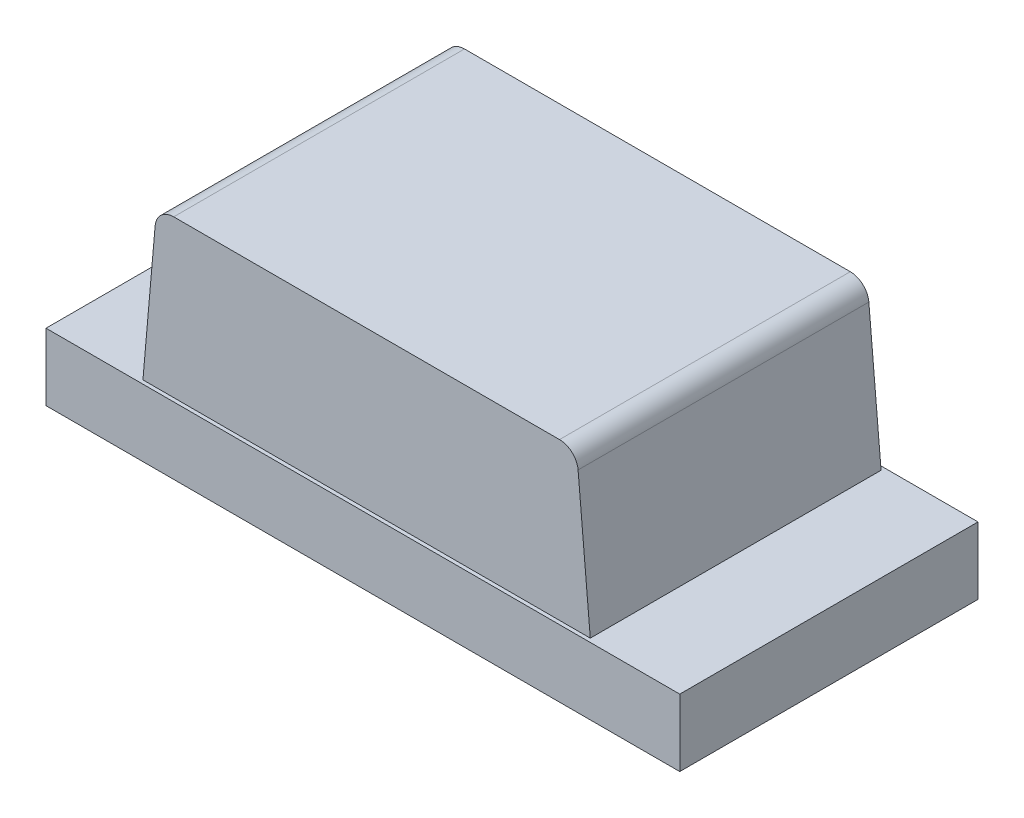
ISO-10303-21;
HEADER;
FILE_DESCRIPTION(('STEP AP214'),'2;1');
FILE_NAME('part.step','',(''),(''),'','','');
FILE_SCHEMA(('AUTOMOTIVE_DESIGN { 1 0 10303 214 1 1 1 1 }'));
ENDSEC;
DATA;
#1=APPLICATION_CONTEXT('core data for automotive mechanical design processes');
#2=APPLICATION_PROTOCOL_DEFINITION('international standard','automotive_design',2000,#1);
#3=PRODUCT_CONTEXT('',#1,'mechanical');
#4=PRODUCT('Part','Part','',(#3));
#5=PRODUCT_RELATED_PRODUCT_CATEGORY('part','',(#4));
#6=PRODUCT_DEFINITION_FORMATION('','',#4);
#7=PRODUCT_DEFINITION_CONTEXT('part definition',#1,'design');
#8=PRODUCT_DEFINITION('design','',#6,#7);
#9=PRODUCT_DEFINITION_SHAPE('','',#8);
#10=(LENGTH_UNIT() NAMED_UNIT(*) SI_UNIT(.MILLI.,.METRE.));
#11=(NAMED_UNIT(*) PLANE_ANGLE_UNIT() SI_UNIT($,.RADIAN.));
#12=(NAMED_UNIT(*) SI_UNIT($,.STERADIAN.) SOLID_ANGLE_UNIT());
#13=UNCERTAINTY_MEASURE_WITH_UNIT(LENGTH_MEASURE(1.E-05),#10,'distance_accuracy_value','');
#14=(GEOMETRIC_REPRESENTATION_CONTEXT(3) GLOBAL_UNCERTAINTY_ASSIGNED_CONTEXT((#13)) GLOBAL_UNIT_ASSIGNED_CONTEXT((#10,
#11,#12)) REPRESENTATION_CONTEXT('',''));
#15=CARTESIAN_POINT('',(0.,0.,0.));
#16=DIRECTION('',(0.,0.,1.));
#17=DIRECTION('',(1.,0.,0.));
#18=AXIS2_PLACEMENT_3D('',#15,#16,#17);
#19=CARTESIAN_POINT('',(0.,0.18,0.));
#20=DIRECTION('',(0.,1.,0.));
#21=DIRECTION('',(0.,0.,1.));
#22=AXIS2_PLACEMENT_3D('',#19,#20,#21);
#23=PLANE('',#22);
#24=DIRECTION('',(0.,0.,1.));
#25=VECTOR('',#24,1.);
#26=CARTESIAN_POINT('',(-0.85,0.18,0.4));
#27=LINE('',#26,#25);
#28=CARTESIAN_POINT('',(-0.85,0.18,-0.4));
#29=VERTEX_POINT('',#28);
#30=CARTESIAN_POINT('',(-0.85,0.18,0.4));
#31=VERTEX_POINT('',#30);
#32=EDGE_CURVE('E144',#29,#31,#27,.T.);
#33=ORIENTED_EDGE('',*,*,#32,.T.);
#34=DIRECTION('',(1.,0.,0.));
#35=VECTOR('',#34,1.);
#36=CARTESIAN_POINT('',(0.85,0.18,0.4));
#37=LINE('',#36,#35);
#38=CARTESIAN_POINT('',(0.85,0.18,0.4));
#39=VERTEX_POINT('',#38);
#40=EDGE_CURVE('E147',#31,#39,#37,.T.);
#41=ORIENTED_EDGE('',*,*,#40,.T.);
#42=DIRECTION('',(0.,0.,-1.));
#43=VECTOR('',#42,1.);
#44=CARTESIAN_POINT('',(0.85,0.18,0.4));
#45=LINE('',#44,#43);
#46=CARTESIAN_POINT('',(0.85,0.18,-0.4));
#47=VERTEX_POINT('',#46);
#48=EDGE_CURVE('E150',#39,#47,#45,.T.);
#49=ORIENTED_EDGE('',*,*,#48,.T.);
#50=DIRECTION('',(-1.,0.,0.));
#51=VECTOR('',#50,1.);
#52=CARTESIAN_POINT('',(0.85,0.18,-0.4));
#53=LINE('',#52,#51);
#54=EDGE_CURVE('E152',#47,#29,#53,.T.);
#55=ORIENTED_EDGE('',*,*,#54,.T.);
#56=EDGE_LOOP('',(#33,#41,#49,#55));
#57=FACE_BOUND('',#56,.T.);
#58=DIRECTION('',(0.,0.,-1.));
#59=VECTOR('',#58,1.);
#60=CARTESIAN_POINT('',(0.6,0.18,1.67137720602503));
#61=LINE('',#60,#59);
#62=CARTESIAN_POINT('',(0.6,0.18,0.39));
#63=VERTEX_POINT('',#62);
#64=CARTESIAN_POINT('',(0.6,0.18,-0.39));
#65=VERTEX_POINT('',#64);
#66=EDGE_CURVE('E134',#63,#65,#61,.T.);
#67=ORIENTED_EDGE('',*,*,#66,.F.);
#68=DIRECTION('',(-1.,0.,0.));
#69=VECTOR('',#68,1.);
#70=CARTESIAN_POINT('',(0.6,0.18,0.39));
#71=LINE('',#70,#69);
#72=CARTESIAN_POINT('',(-0.6,0.18,0.39));
#73=VERTEX_POINT('',#72);
#74=EDGE_CURVE('E133',#63,#73,#71,.T.);
#75=ORIENTED_EDGE('',*,*,#74,.T.);
#76=DIRECTION('',(0.,0.,-1.));
#77=VECTOR('',#76,1.);
#78=CARTESIAN_POINT('',(-0.6,0.18,1.67137720602503));
#79=LINE('',#78,#77);
#80=CARTESIAN_POINT('',(-0.6,0.18,-0.39));
#81=VERTEX_POINT('',#80);
#82=EDGE_CURVE('E127',#73,#81,#79,.T.);
#83=ORIENTED_EDGE('',*,*,#82,.T.);
#84=DIRECTION('',(-1.,0.,0.));
#85=VECTOR('',#84,1.);
#86=CARTESIAN_POINT('',(0.6,0.18,-0.39));
#87=LINE('',#86,#85);
#88=EDGE_CURVE('E113',#65,#81,#87,.T.);
#89=ORIENTED_EDGE('',*,*,#88,.F.);
#90=EDGE_LOOP('',(#67,#75,#83,#89));
#91=FACE_BOUND('',#90,.T.);
#92=ADVANCED_FACE('F34',(#57,#91),#23,.T.);
#93=CARTESIAN_POINT('',(-0.85,0.18,0.4));
#94=DIRECTION('',(1.,0.,0.));
#95=DIRECTION('',(0.,0.,-1.));
#96=AXIS2_PLACEMENT_3D('',#93,#94,#95);
#97=PLANE('',#96);
#98=DIRECTION('',(0.,0.,1.));
#99=VECTOR('',#98,1.);
#100=CARTESIAN_POINT('',(-0.85,0.,0.4));
#101=LINE('',#100,#99);
#102=CARTESIAN_POINT('',(-0.85,0.,-0.4));
#103=VERTEX_POINT('',#102);
#104=CARTESIAN_POINT('',(-0.85,0.,0.4));
#105=VERTEX_POINT('',#104);
#106=EDGE_CURVE('E155',#103,#105,#101,.T.);
#107=ORIENTED_EDGE('',*,*,#106,.T.);
#108=DIRECTION('',(0.,-1.,0.));
#109=VECTOR('',#108,1.);
#110=CARTESIAN_POINT('',(-0.85,0.18,0.4));
#111=LINE('',#110,#109);
#112=EDGE_CURVE('E171',#31,#105,#111,.T.);
#113=ORIENTED_EDGE('',*,*,#112,.F.);
#114=ORIENTED_EDGE('',*,*,#32,.F.);
#115=DIRECTION('',(0.,-1.,0.));
#116=VECTOR('',#115,1.);
#117=CARTESIAN_POINT('',(-0.85,0.18,-0.4));
#118=LINE('',#117,#116);
#119=EDGE_CURVE('E154',#29,#103,#118,.T.);
#120=ORIENTED_EDGE('',*,*,#119,.T.);
#121=EDGE_LOOP('',(#107,#113,#114,#120));
#122=FACE_BOUND('',#121,.T.);
#123=ADVANCED_FACE('F204',(#122),#97,.F.);
#124=CARTESIAN_POINT('',(0.85,0.18,0.4));
#125=DIRECTION('',(0.,0.,-1.));
#126=DIRECTION('',(-1.,0.,0.));
#127=AXIS2_PLACEMENT_3D('',#124,#125,#126);
#128=PLANE('',#127);
#129=DIRECTION('',(1.,0.,0.));
#130=VECTOR('',#129,1.);
#131=CARTESIAN_POINT('',(0.85,0.,0.4));
#132=LINE('',#131,#130);
#133=CARTESIAN_POINT('',(0.85,0.,0.4));
#134=VERTEX_POINT('',#133);
#135=EDGE_CURVE('E158',#105,#134,#132,.T.);
#136=ORIENTED_EDGE('',*,*,#135,.T.);
#137=DIRECTION('',(0.,-1.,0.));
#138=VECTOR('',#137,1.);
#139=CARTESIAN_POINT('',(0.85,0.18,0.4));
#140=LINE('',#139,#138);
#141=EDGE_CURVE('E168',#39,#134,#140,.T.);
#142=ORIENTED_EDGE('',*,*,#141,.F.);
#143=ORIENTED_EDGE('',*,*,#40,.F.);
#144=ORIENTED_EDGE('',*,*,#112,.T.);
#145=EDGE_LOOP('',(#136,#142,#143,#144));
#146=FACE_BOUND('',#145,.T.);
#147=ADVANCED_FACE('F210',(#146),#128,.F.);
#148=CARTESIAN_POINT('',(0.85,0.18,0.4));
#149=DIRECTION('',(-1.,0.,0.));
#150=DIRECTION('',(0.,0.,1.));
#151=AXIS2_PLACEMENT_3D('',#148,#149,#150);
#152=PLANE('',#151);
#153=DIRECTION('',(0.,0.,-1.));
#154=VECTOR('',#153,1.);
#155=CARTESIAN_POINT('',(0.85,0.,0.4));
#156=LINE('',#155,#154);
#157=CARTESIAN_POINT('',(0.85,0.,-0.4));
#158=VERTEX_POINT('',#157);
#159=EDGE_CURVE('E160',#134,#158,#156,.T.);
#160=ORIENTED_EDGE('',*,*,#159,.T.);
#161=DIRECTION('',(0.,-1.,0.));
#162=VECTOR('',#161,1.);
#163=CARTESIAN_POINT('',(0.85,0.18,-0.4));
#164=LINE('',#163,#162);
#165=EDGE_CURVE('E165',#47,#158,#164,.T.);
#166=ORIENTED_EDGE('',*,*,#165,.F.);
#167=ORIENTED_EDGE('',*,*,#48,.F.);
#168=ORIENTED_EDGE('',*,*,#141,.T.);
#169=EDGE_LOOP('',(#160,#166,#167,#168));
#170=FACE_BOUND('',#169,.T.);
#171=ADVANCED_FACE('F223',(#170),#152,.F.);
#172=CARTESIAN_POINT('',(0.85,0.18,-0.4));
#173=DIRECTION('',(0.,0.,1.));
#174=DIRECTION('',(1.,0.,0.));
#175=AXIS2_PLACEMENT_3D('',#172,#173,#174);
#176=PLANE('',#175);
#177=DIRECTION('',(-1.,0.,0.));
#178=VECTOR('',#177,1.);
#179=CARTESIAN_POINT('',(0.85,0.,-0.4));
#180=LINE('',#179,#178);
#181=EDGE_CURVE('E148',#158,#103,#180,.T.);
#182=ORIENTED_EDGE('',*,*,#181,.T.);
#183=ORIENTED_EDGE('',*,*,#119,.F.);
#184=ORIENTED_EDGE('',*,*,#54,.F.);
#185=ORIENTED_EDGE('',*,*,#165,.T.);
#186=EDGE_LOOP('',(#182,#183,#184,#185));
#187=FACE_BOUND('',#186,.T.);
#188=ADVANCED_FACE('F219',(#187),#176,.F.);
#189=CARTESIAN_POINT('',(0.,0.,0.));
#190=DIRECTION('',(0.,1.,0.));
#191=DIRECTION('',(0.,0.,1.));
#192=AXIS2_PLACEMENT_3D('',#189,#190,#191);
#193=PLANE('',#192);
#194=ORIENTED_EDGE('',*,*,#106,.F.);
#195=ORIENTED_EDGE('',*,*,#181,.F.);
#196=ORIENTED_EDGE('',*,*,#159,.F.);
#197=ORIENTED_EDGE('',*,*,#135,.F.);
#198=EDGE_LOOP('',(#194,#195,#196,#197));
#199=FACE_BOUND('',#198,.T.);
#200=ADVANCED_FACE('F216',(#199),#193,.F.);
#201=CARTESIAN_POINT('',(-0.6,0.18,1.67137720602503));
#202=DIRECTION('',(0.996194698091746,-0.0871557427476547,0.));
#203=DIRECTION('',(0.0871557427476547,0.996194698091746,0.));
#204=AXIS2_PLACEMENT_3D('',#201,#202,#203);
#205=PLANE('',#204);
#206=DIRECTION('',(0.0871557427476547,0.996194698091746,0.));
#207=VECTOR('',#206,1.);
#208=CARTESIAN_POINT('',(-0.6,0.18,0.39));
#209=LINE('',#208,#207);
#210=CARTESIAN_POINT('',(-0.567247937522829,0.554357787137383,0.39));
#211=VERTEX_POINT('',#210);
#212=EDGE_CURVE('E136',#73,#211,#209,.T.);
#213=ORIENTED_EDGE('',*,*,#212,.T.);
#214=DIRECTION('',(0.,0.,-1.));
#215=VECTOR('',#214,1.);
#216=CARTESIAN_POINT('',(-0.567247937522829,0.554357787137383,1.67137720602503));
#217=LINE('',#216,#215);
#218=CARTESIAN_POINT('',(-0.567247937522829,0.554357787137383,-0.39));
#219=VERTEX_POINT('',#218);
#220=EDGE_CURVE('E12',#211,#219,#217,.T.);
#221=ORIENTED_EDGE('',*,*,#220,.T.);
#222=DIRECTION('',(0.0871557427476547,0.996194698091746,0.));
#223=VECTOR('',#222,1.);
#224=CARTESIAN_POINT('',(-0.6,0.18,-0.39));
#225=LINE('',#224,#223);
#226=EDGE_CURVE('E117',#81,#219,#225,.T.);
#227=ORIENTED_EDGE('',*,*,#226,.F.);
#228=ORIENTED_EDGE('',*,*,#82,.F.);
#229=EDGE_LOOP('',(#213,#221,#227,#228));
#230=FACE_BOUND('',#229,.T.);
#231=ADVANCED_FACE('F126',(#230),#205,.F.);
#232=CARTESIAN_POINT('',(-0.563254761319113,0.6,1.67137720602503));
#233=DIRECTION('',(0.,-1.,0.));
#234=DIRECTION('',(0.,0.,-1.));
#235=AXIS2_PLACEMENT_3D('',#232,#233,#234);
#236=PLANE('',#235);
#237=DIRECTION('',(1.,0.,0.));
#238=VECTOR('',#237,1.);
#239=CARTESIAN_POINT('',(-0.563254761319114,0.6,0.39));
#240=LINE('',#239,#238);
#241=CARTESIAN_POINT('',(-0.517438202618242,0.6,0.39));
#242=VERTEX_POINT('',#241);
#243=CARTESIAN_POINT('',(0.517438202618242,0.6,0.39));
#244=VERTEX_POINT('',#243);
#245=EDGE_CURVE('E143',#242,#244,#240,.T.);
#246=ORIENTED_EDGE('',*,*,#245,.T.);
#247=DIRECTION('',(0.,0.,-1.));
#248=VECTOR('',#247,1.);
#249=CARTESIAN_POINT('',(0.517438202618242,0.6,1.67137720602503));
#250=LINE('',#249,#248);
#251=CARTESIAN_POINT('',(0.517438202618242,0.6,-0.39));
#252=VERTEX_POINT('',#251);
#253=EDGE_CURVE('E176',#244,#252,#250,.T.);
#254=ORIENTED_EDGE('',*,*,#253,.T.);
#255=DIRECTION('',(1.,0.,0.));
#256=VECTOR('',#255,1.);
#257=CARTESIAN_POINT('',(-0.563254761319113,0.6,-0.39));
#258=LINE('',#257,#256);
#259=CARTESIAN_POINT('',(-0.517438202618242,0.6,-0.39));
#260=VERTEX_POINT('',#259);
#261=EDGE_CURVE('E130',#260,#252,#258,.T.);
#262=ORIENTED_EDGE('',*,*,#261,.F.);
#263=DIRECTION('',(0.,0.,-1.));
#264=VECTOR('',#263,1.);
#265=CARTESIAN_POINT('',(-0.517438202618242,0.6,1.67137720602503));
#266=LINE('',#265,#264);
#267=EDGE_CURVE('E174',#260,#242,#266,.F.);
#268=ORIENTED_EDGE('',*,*,#267,.T.);
#269=EDGE_LOOP('',(#246,#254,#262,#268));
#270=FACE_BOUND('',#269,.T.);
#271=ADVANCED_FACE('F191',(#270),#236,.F.);
#272=CARTESIAN_POINT('',(0.563254761319113,0.6,1.67137720602503));
#273=DIRECTION('',(-0.996194698091746,-0.0871557427476547,0.));
#274=DIRECTION('',(0.0871557427476547,-0.996194698091746,0.));
#275=AXIS2_PLACEMENT_3D('',#272,#273,#274);
#276=PLANE('',#275);
#277=DIRECTION('',(0.0871557427476547,-0.996194698091746,0.));
#278=VECTOR('',#277,1.);
#279=CARTESIAN_POINT('',(0.563254761319113,0.6,-0.39));
#280=LINE('',#279,#278);
#281=CARTESIAN_POINT('',(0.567247937522829,0.554357787137383,-0.39));
#282=VERTEX_POINT('',#281);
#283=EDGE_CURVE('E118',#282,#65,#280,.T.);
#284=ORIENTED_EDGE('',*,*,#283,.F.);
#285=DIRECTION('',(0.,0.,-1.));
#286=VECTOR('',#285,1.);
#287=CARTESIAN_POINT('',(0.567247937522829,0.554357787137383,1.67137720602503));
#288=LINE('',#287,#286);
#289=CARTESIAN_POINT('',(0.567247937522829,0.554357787137383,0.39));
#290=VERTEX_POINT('',#289);
#291=EDGE_CURVE('E57',#282,#290,#288,.F.);
#292=ORIENTED_EDGE('',*,*,#291,.T.);
#293=DIRECTION('',(0.0871557427476547,-0.996194698091746,0.));
#294=VECTOR('',#293,1.);
#295=CARTESIAN_POINT('',(0.563254761319113,0.6,0.39));
#296=LINE('',#295,#294);
#297=EDGE_CURVE('E187',#290,#63,#296,.T.);
#298=ORIENTED_EDGE('',*,*,#297,.T.);
#299=ORIENTED_EDGE('',*,*,#66,.T.);
#300=EDGE_LOOP('',(#284,#292,#298,#299));
#301=FACE_BOUND('',#300,.T.);
#302=ADVANCED_FACE('F196',(#301),#276,.F.);
#303=CARTESIAN_POINT('',(0.85,0.18,0.39));
#304=DIRECTION('',(0.,0.,-1.));
#305=DIRECTION('',(-1.,0.,0.));
#306=AXIS2_PLACEMENT_3D('',#303,#304,#305);
#307=PLANE('',#306);
#308=ORIENTED_EDGE('',*,*,#297,.F.);
#309=CARTESIAN_POINT('',(0.517438202618242,0.55,0.39));
#310=DIRECTION('',(0.,0.,-1.));
#311=DIRECTION('',(-1.,0.,0.));
#312=AXIS2_PLACEMENT_3D('',#309,#310,#311);
#313=CIRCLE('',#312,0.05);
#314=EDGE_CURVE('E42',#290,#244,#313,.F.);
#315=ORIENTED_EDGE('',*,*,#314,.T.);
#316=ORIENTED_EDGE('',*,*,#245,.F.);
#317=CARTESIAN_POINT('',(-0.517438202618242,0.55,0.39));
#318=DIRECTION('',(0.,0.,-1.));
#319=DIRECTION('',(-1.,0.,0.));
#320=AXIS2_PLACEMENT_3D('',#317,#318,#319);
#321=CIRCLE('',#320,0.05);
#322=EDGE_CURVE('E49',#242,#211,#321,.F.);
#323=ORIENTED_EDGE('',*,*,#322,.T.);
#324=ORIENTED_EDGE('',*,*,#212,.F.);
#325=ORIENTED_EDGE('',*,*,#74,.F.);
#326=EDGE_LOOP('',(#308,#315,#316,#323,#324,#325));
#327=FACE_BOUND('',#326,.T.);
#328=ADVANCED_FACE('F186',(#327),#307,.F.);
#329=CARTESIAN_POINT('',(0.85,0.18,-0.39));
#330=DIRECTION('',(0.,0.,1.));
#331=DIRECTION('',(1.,0.,0.));
#332=AXIS2_PLACEMENT_3D('',#329,#330,#331);
#333=PLANE('',#332);
#334=ORIENTED_EDGE('',*,*,#261,.T.);
#335=CARTESIAN_POINT('',(0.517438202618242,0.55,-0.39));
#336=DIRECTION('',(0.,0.,1.));
#337=DIRECTION('',(1.,0.,0.));
#338=AXIS2_PLACEMENT_3D('',#335,#336,#337);
#339=CIRCLE('',#338,0.05);
#340=EDGE_CURVE('E181',#252,#282,#339,.F.);
#341=ORIENTED_EDGE('',*,*,#340,.T.);
#342=ORIENTED_EDGE('',*,*,#283,.T.);
#343=ORIENTED_EDGE('',*,*,#88,.T.);
#344=ORIENTED_EDGE('',*,*,#226,.T.);
#345=CARTESIAN_POINT('',(-0.517438202618242,0.55,-0.39));
#346=DIRECTION('',(0.,0.,1.));
#347=DIRECTION('',(1.,0.,0.));
#348=AXIS2_PLACEMENT_3D('',#345,#346,#347);
#349=CIRCLE('',#348,0.05);
#350=EDGE_CURVE('E179',#219,#260,#349,.F.);
#351=ORIENTED_EDGE('',*,*,#350,.T.);
#352=EDGE_LOOP('',(#334,#341,#342,#343,#344,#351));
#353=FACE_BOUND('',#352,.T.);
#354=ADVANCED_FACE('F116',(#353),#333,.F.);
#355=CARTESIAN_POINT('',(0.517438202618242,0.55,1.67137720602503));
#356=DIRECTION('',(0.,0.,-1.));
#357=DIRECTION('',(-1.,0.,0.));
#358=AXIS2_PLACEMENT_3D('',#355,#356,#357);
#359=CYLINDRICAL_SURFACE('',#358,0.05);
#360=ORIENTED_EDGE('',*,*,#314,.F.);
#361=ORIENTED_EDGE('',*,*,#291,.F.);
#362=ORIENTED_EDGE('',*,*,#340,.F.);
#363=ORIENTED_EDGE('',*,*,#253,.F.);
#364=EDGE_LOOP('',(#360,#361,#362,#363));
#365=FACE_BOUND('',#364,.T.);
#366=ADVANCED_FACE('F195',(#365),#359,.T.);
#367=CARTESIAN_POINT('',(-0.517438202618242,0.55,1.67137720602503));
#368=DIRECTION('',(0.,0.,-1.));
#369=DIRECTION('',(-1.,0.,0.));
#370=AXIS2_PLACEMENT_3D('',#367,#368,#369);
#371=CYLINDRICAL_SURFACE('',#370,0.05);
#372=ORIENTED_EDGE('',*,*,#322,.F.);
#373=ORIENTED_EDGE('',*,*,#267,.F.);
#374=ORIENTED_EDGE('',*,*,#350,.F.);
#375=ORIENTED_EDGE('',*,*,#220,.F.);
#376=EDGE_LOOP('',(#372,#373,#374,#375));
#377=FACE_BOUND('',#376,.T.);
#378=ADVANCED_FACE('F36',(#377),#371,.T.);
#379=CLOSED_SHELL('',(#92,#123,#147,#171,#188,#200,#231,#271,#302,#328,#354,#366,#378));
#380=MANIFOLD_SOLID_BREP('B2',#379);
#381=ADVANCED_BREP_SHAPE_REPRESENTATION('',(#18,#380),#14);
#382=SHAPE_DEFINITION_REPRESENTATION(#9,#381);
ENDSEC;
END-ISO-10303-21;
